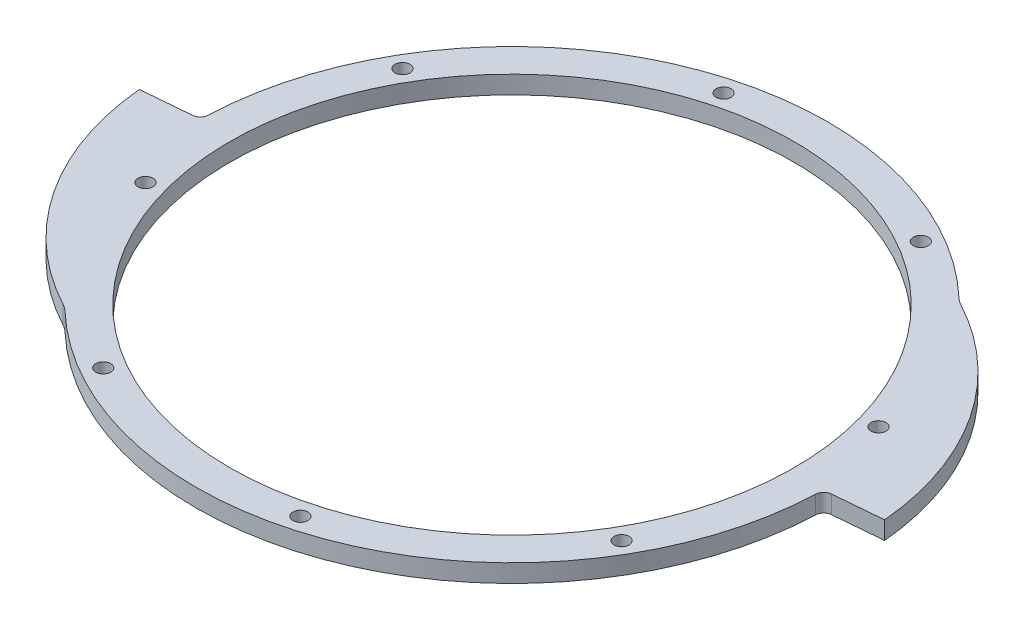
ISO-10303-21;
HEADER;
FILE_DESCRIPTION(('STEP AP214'),'2;1');
FILE_NAME('part.step','',(''),(''),'','','');
FILE_SCHEMA(('AUTOMOTIVE_DESIGN { 1 0 10303 214 1 1 1 1 }'));
ENDSEC;
DATA;
#1=APPLICATION_CONTEXT('core data for automotive mechanical design processes');
#2=APPLICATION_PROTOCOL_DEFINITION('international standard','automotive_design',2000,#1);
#3=PRODUCT_CONTEXT('',#1,'mechanical');
#4=PRODUCT('Part','Part','',(#3));
#5=PRODUCT_RELATED_PRODUCT_CATEGORY('part','',(#4));
#6=PRODUCT_DEFINITION_FORMATION('','',#4);
#7=PRODUCT_DEFINITION_CONTEXT('part definition',#1,'design');
#8=PRODUCT_DEFINITION('design','',#6,#7);
#9=PRODUCT_DEFINITION_SHAPE('','',#8);
#10=(LENGTH_UNIT() NAMED_UNIT(*) SI_UNIT(.MILLI.,.METRE.));
#11=(NAMED_UNIT(*) PLANE_ANGLE_UNIT() SI_UNIT($,.RADIAN.));
#12=(NAMED_UNIT(*) SI_UNIT($,.STERADIAN.) SOLID_ANGLE_UNIT());
#13=UNCERTAINTY_MEASURE_WITH_UNIT(LENGTH_MEASURE(1.E-05),#10,'distance_accuracy_value','');
#14=(GEOMETRIC_REPRESENTATION_CONTEXT(3) GLOBAL_UNCERTAINTY_ASSIGNED_CONTEXT((#13)) GLOBAL_UNIT_ASSIGNED_CONTEXT((#10,
#11,#12)) REPRESENTATION_CONTEXT('',''));
#15=CARTESIAN_POINT('',(0.,0.,0.));
#16=DIRECTION('',(0.,0.,1.));
#17=DIRECTION('',(1.,0.,0.));
#18=AXIS2_PLACEMENT_3D('',#15,#16,#17);
#19=CARTESIAN_POINT('',(0.,3.175,0.));
#20=DIRECTION('',(0.,-1.,0.));
#21=DIRECTION('',(0.,0.,-1.));
#22=AXIS2_PLACEMENT_3D('',#19,#20,#21);
#23=CYLINDRICAL_SURFACE('',#22,112.);
#24=DIRECTION('',(0.,-1.,0.));
#25=VECTOR('',#24,1.);
#26=CARTESIAN_POINT('',(111.913972575424,3.175,4.38893408325421));
#27=LINE('',#26,#25);
#28=CARTESIAN_POINT('',(111.913972575424,-3.175,4.38893408325421));
#29=VERTEX_POINT('',#28);
#30=CARTESIAN_POINT('',(111.913972575424,3.175,4.38893408325421));
#31=VERTEX_POINT('',#30);
#32=EDGE_CURVE('E59',#29,#31,#27,.F.);
#33=ORIENTED_EDGE('',*,*,#32,.T.);
#34=CARTESIAN_POINT('',(0.,3.175,0.));
#35=DIRECTION('',(0.,1.,0.));
#36=DIRECTION('',(0.,0.,1.));
#37=AXIS2_PLACEMENT_3D('',#34,#35,#36);
#38=CIRCLE('',#37,112.);
#39=CARTESIAN_POINT('',(-77.2844594992042,3.175,81.0623976940965));
#40=VERTEX_POINT('',#39);
#41=EDGE_CURVE('E164',#40,#31,#38,.T.);
#42=ORIENTED_EDGE('',*,*,#41,.F.);
#43=DIRECTION('',(0.,-1.,0.));
#44=VECTOR('',#43,1.);
#45=CARTESIAN_POINT('',(-77.2844594992042,3.175,81.0623976940965));
#46=LINE('',#45,#44);
#47=CARTESIAN_POINT('',(-77.2844594992042,-3.175,81.0623976940965));
#48=VERTEX_POINT('',#47);
#49=EDGE_CURVE('E179',#40,#48,#46,.T.);
#50=ORIENTED_EDGE('',*,*,#49,.T.);
#51=CARTESIAN_POINT('',(0.,-3.175,0.));
#52=DIRECTION('',(0.,1.,0.));
#53=DIRECTION('',(0.,0.,1.));
#54=AXIS2_PLACEMENT_3D('',#51,#52,#53);
#55=CIRCLE('',#54,112.);
#56=EDGE_CURVE('E174',#48,#29,#55,.T.);
#57=ORIENTED_EDGE('',*,*,#56,.T.);
#58=EDGE_LOOP('',(#33,#42,#50,#57));
#59=FACE_BOUND('',#58,.T.);
#60=ADVANCED_FACE('F36',(#59),#23,.T.);
#61=CARTESIAN_POINT('',(-32.4231042819711,3.175,-8.71184952443067));
#62=DIRECTION('',(0.,1.,0.));
#63=DIRECTION('',(0.,0.,1.));
#64=AXIS2_PLACEMENT_3D('',#61,#62,#63);
#65=PLANE('',#64);
#66=CARTESIAN_POINT('',(-91.7986928011501,3.175,-53.0000000000007));
#67=DIRECTION('',(0.,1.,0.));
#68=DIRECTION('',(-0.707106781186549,0.,0.707106781186546));
#69=AXIS2_PLACEMENT_3D('',#66,#67,#68);
#70=CIRCLE('',#69,2.65);
#71=CARTESIAN_POINT('',(-93.6725257712944,3.175,-51.1261670298564));
#72=VERTEX_POINT('',#71);
#73=EDGE_CURVE('E283',#72,#72,#70,.T.);
#74=ORIENTED_EDGE('',*,*,#73,.F.);
#75=EDGE_LOOP('',(#74));
#76=FACE_BOUND('',#75,.T.);
#77=CARTESIAN_POINT('',(-27.4348187808662,3.175,-102.388137586642));
#78=DIRECTION('',(0.,1.,0.));
#79=DIRECTION('',(-1.,0.,0.));
#80=AXIS2_PLACEMENT_3D('',#77,#78,#79);
#81=CIRCLE('',#80,2.65);
#82=CARTESIAN_POINT('',(-30.0848187808662,3.175,-102.388137586642));
#83=VERTEX_POINT('',#82);
#84=EDGE_CURVE('E289',#83,#83,#81,.T.);
#85=ORIENTED_EDGE('',*,*,#84,.F.);
#86=EDGE_LOOP('',(#85));
#87=FACE_BOUND('',#86,.T.);
#88=CARTESIAN_POINT('',(53.0000000000011,3.175,-91.7986928011499));
#89=DIRECTION('',(0.,1.,0.));
#90=DIRECTION('',(-0.707106781186544,0.,-0.707106781186551));
#91=AXIS2_PLACEMENT_3D('',#88,#89,#90);
#92=CIRCLE('',#91,2.65);
#93=CARTESIAN_POINT('',(51.1261670298567,3.175,-93.6725257712942));
#94=VERTEX_POINT('',#93);
#95=EDGE_CURVE('E297',#94,#94,#92,.T.);
#96=ORIENTED_EDGE('',*,*,#95,.F.);
#97=EDGE_LOOP('',(#96));
#98=FACE_BOUND('',#97,.T.);
#99=CARTESIAN_POINT('',(102.388137586641,3.175,-27.4348187808666));
#100=DIRECTION('',(0.,1.,0.));
#101=DIRECTION('',(0.,0.,-1.));
#102=AXIS2_PLACEMENT_3D('',#99,#100,#101);
#103=CIRCLE('',#102,2.65);
#104=CARTESIAN_POINT('',(102.388137586641,3.175,-30.0848187808666));
#105=VERTEX_POINT('',#104);
#106=EDGE_CURVE('E303',#105,#105,#103,.T.);
#107=ORIENTED_EDGE('',*,*,#106,.F.);
#108=EDGE_LOOP('',(#107));
#109=FACE_BOUND('',#108,.T.);
#110=CARTESIAN_POINT('',(91.7986928011497,3.175,53.0000000000014));
#111=DIRECTION('',(0.,1.,0.));
#112=DIRECTION('',(0.707106781186554,0.,-0.707106781186541));
#113=AXIS2_PLACEMENT_3D('',#110,#111,#112);
#114=CIRCLE('',#113,2.65);
#115=CARTESIAN_POINT('',(93.6725257712941,3.175,51.126167029857));
#116=VERTEX_POINT('',#115);
#117=EDGE_CURVE('E309',#116,#116,#114,.T.);
#118=ORIENTED_EDGE('',*,*,#117,.F.);
#119=EDGE_LOOP('',(#118));
#120=FACE_BOUND('',#119,.T.);
#121=CARTESIAN_POINT('',(27.4348187808655,3.175,102.388137586642));
#122=DIRECTION('',(0.,1.,0.));
#123=DIRECTION('',(1.,0.,0.));
#124=AXIS2_PLACEMENT_3D('',#121,#122,#123);
#125=CIRCLE('',#124,2.65);
#126=CARTESIAN_POINT('',(30.0848187808655,3.175,102.388137586642));
#127=VERTEX_POINT('',#126);
#128=EDGE_CURVE('E315',#127,#127,#125,.T.);
#129=ORIENTED_EDGE('',*,*,#128,.F.);
#130=EDGE_LOOP('',(#129));
#131=FACE_BOUND('',#130,.T.);
#132=CARTESIAN_POINT('',(-53.0000000000017,3.175,91.7986928011495));
#133=DIRECTION('',(0.,1.,0.));
#134=DIRECTION('',(0.707106781186539,0.,0.707106781186556));
#135=AXIS2_PLACEMENT_3D('',#132,#133,#134);
#136=CIRCLE('',#135,2.65);
#137=CARTESIAN_POINT('',(-51.1261670298574,3.175,93.6725257712939));
#138=VERTEX_POINT('',#137);
#139=EDGE_CURVE('E321',#138,#138,#136,.T.);
#140=ORIENTED_EDGE('',*,*,#139,.F.);
#141=EDGE_LOOP('',(#140));
#142=FACE_BOUND('',#141,.T.);
#143=CARTESIAN_POINT('',(-102.388137586641,3.175,27.4348187808666));
#144=DIRECTION('',(0.,1.,0.));
#145=DIRECTION('',(0.,0.,1.));
#146=AXIS2_PLACEMENT_3D('',#143,#144,#145);
#147=CIRCLE('',#146,2.65);
#148=CARTESIAN_POINT('',(-102.388137586641,3.175,30.0848187808666));
#149=VERTEX_POINT('',#148);
#150=EDGE_CURVE('E286',#149,#149,#147,.T.);
#151=ORIENTED_EDGE('',*,*,#150,.F.);
#152=EDGE_LOOP('',(#151));
#153=FACE_BOUND('',#152,.T.);
#154=CARTESIAN_POINT('',(77.2844594992042,3.175,-81.0623976940965));
#155=VERTEX_POINT('',#154);
#156=CARTESIAN_POINT('',(-111.913972575424,3.175,-4.38893408325421));
#157=VERTEX_POINT('',#156);
#158=EDGE_CURVE('E51',#155,#157,#38,.T.);
#159=ORIENTED_EDGE('',*,*,#158,.T.);
#160=CARTESIAN_POINT('',(-114.911668269409,3.175,-4.5064948176271));
#161=DIRECTION('',(0.,1.,0.));
#162=DIRECTION('',(0.,0.,1.));
#163=AXIS2_PLACEMENT_3D('',#160,#161,#162);
#164=CIRCLE('',#163,3.);
#165=CARTESIAN_POINT('',(-114.650201041166,3.175,-1.51791072335186));
#166=VERTEX_POINT('',#165);
#167=EDGE_CURVE('E11',#157,#166,#164,.F.);
#168=ORIENTED_EDGE('',*,*,#167,.T.);
#169=DIRECTION('',(-0.996194698091746,0.,0.0871557427476584));
#170=VECTOR('',#169,1.);
#171=CARTESIAN_POINT('',(-111.98631211554,3.175,-1.75097080523636));
#172=LINE('',#171,#170);
#173=CARTESIAN_POINT('',(-132.,3.175,0.));
#174=VERTEX_POINT('',#173);
#175=EDGE_CURVE('E166',#166,#174,#172,.T.);
#176=ORIENTED_EDGE('',*,*,#175,.T.);
#177=CARTESIAN_POINT('',(-32.4231042819711,3.175,-8.71184952443067));
#178=DIRECTION('',(0.,1.,0.));
#179=DIRECTION('',(0.,0.,1.));
#180=AXIS2_PLACEMENT_3D('',#177,#178,#179);
#181=CIRCLE('',#180,99.9572632827426);
#182=CARTESIAN_POINT('',(-79.4774148094802,3.175,79.4774148094794));
#183=VERTEX_POINT('',#182);
#184=EDGE_CURVE('E158',#174,#183,#181,.T.);
#185=ORIENTED_EDGE('',*,*,#184,.T.);
#186=CARTESIAN_POINT('',(-84.184857668776,3.175,88.3001117739266));
#187=DIRECTION('',(0.,-1.,0.));
#188=DIRECTION('',(0.,0.,-1.));
#189=AXIS2_PLACEMENT_3D('',#186,#187,#188);
#190=CIRCLE('',#189,10.);
#191=EDGE_CURVE('E161',#183,#40,#190,.T.);
#192=ORIENTED_EDGE('',*,*,#191,.T.);
#193=ORIENTED_EDGE('',*,*,#41,.T.);
#194=CARTESIAN_POINT('',(114.911668269409,3.175,4.5064948176271));
#195=DIRECTION('',(0.,1.,0.));
#196=DIRECTION('',(0.,0.,-1.));
#197=AXIS2_PLACEMENT_3D('',#194,#195,#196);
#198=CIRCLE('',#197,3.);
#199=CARTESIAN_POINT('',(114.650201041166,3.175,1.51791072335186));
#200=VERTEX_POINT('',#199);
#201=EDGE_CURVE('E149',#31,#200,#198,.F.);
#202=ORIENTED_EDGE('',*,*,#201,.T.);
#203=DIRECTION('',(0.996194698091746,0.,-0.0871557427476584));
#204=VECTOR('',#203,1.);
#205=CARTESIAN_POINT('',(111.98631211554,3.175,1.75097080523636));
#206=LINE('',#205,#204);
#207=CARTESIAN_POINT('',(132.,3.175,0.));
#208=VERTEX_POINT('',#207);
#209=EDGE_CURVE('E122',#200,#208,#206,.T.);
#210=ORIENTED_EDGE('',*,*,#209,.T.);
#211=CARTESIAN_POINT('',(32.4231042819711,3.175,8.71184952443067));
#212=DIRECTION('',(0.,1.,0.));
#213=DIRECTION('',(0.,0.,-1.));
#214=AXIS2_PLACEMENT_3D('',#211,#212,#213);
#215=CIRCLE('',#214,99.9572632827426);
#216=CARTESIAN_POINT('',(79.4774148094802,3.175,-79.4774148094794));
#217=VERTEX_POINT('',#216);
#218=EDGE_CURVE('E123',#208,#217,#215,.T.);
#219=ORIENTED_EDGE('',*,*,#218,.T.);
#220=CARTESIAN_POINT('',(84.184857668776,3.175,-88.3001117739266));
#221=DIRECTION('',(0.,-1.,0.));
#222=DIRECTION('',(0.,0.,1.));
#223=AXIS2_PLACEMENT_3D('',#220,#221,#222);
#224=CIRCLE('',#223,10.);
#225=EDGE_CURVE('E113',#217,#155,#224,.T.);
#226=ORIENTED_EDGE('',*,*,#225,.T.);
#227=EDGE_LOOP('',(#159,#168,#176,#185,#192,#193,#202,#210,#219,#226));
#228=FACE_BOUND('',#227,.T.);
#229=CARTESIAN_POINT('',(0.,3.175,0.));
#230=DIRECTION('',(0.,1.,0.));
#231=DIRECTION('',(0.,0.,1.));
#232=AXIS2_PLACEMENT_3D('',#229,#230,#231);
#233=CIRCLE('',#232,100.);
#234=CARTESIAN_POINT('',(0.,3.175,100.));
#235=VERTEX_POINT('',#234);
#236=EDGE_CURVE('E152',#235,#235,#233,.T.);
#237=ORIENTED_EDGE('',*,*,#236,.F.);
#238=EDGE_LOOP('',(#237));
#239=FACE_BOUND('',#238,.T.);
#240=ADVANCED_FACE('F126',(#76,#87,#98,#109,#120,#131,#142,#153,#228,#239),#65,.T.);
#241=CARTESIAN_POINT('',(-32.4231042819711,-3.175,-8.71184952443067));
#242=DIRECTION('',(0.,1.,0.));
#243=DIRECTION('',(0.,0.,1.));
#244=AXIS2_PLACEMENT_3D('',#241,#242,#243);
#245=PLANE('',#244);
#246=CARTESIAN_POINT('',(-91.7986928011501,-3.175,-53.0000000000007));
#247=DIRECTION('',(0.,1.,0.));
#248=DIRECTION('',(-0.707106781186549,0.,0.707106781186546));
#249=AXIS2_PLACEMENT_3D('',#246,#247,#248);
#250=CIRCLE('',#249,2.65);
#251=CARTESIAN_POINT('',(-93.6725257712944,-3.175,-51.1261670298564));
#252=VERTEX_POINT('',#251);
#253=EDGE_CURVE('E281',#252,#252,#250,.T.);
#254=ORIENTED_EDGE('',*,*,#253,.T.);
#255=EDGE_LOOP('',(#254));
#256=FACE_BOUND('',#255,.T.);
#257=CARTESIAN_POINT('',(-27.4348187808662,-3.175,-102.388137586642));
#258=DIRECTION('',(0.,1.,0.));
#259=DIRECTION('',(-1.,0.,0.));
#260=AXIS2_PLACEMENT_3D('',#257,#258,#259);
#261=CIRCLE('',#260,2.65);
#262=CARTESIAN_POINT('',(-30.0848187808662,-3.175,-102.388137586642));
#263=VERTEX_POINT('',#262);
#264=EDGE_CURVE('E284',#263,#263,#261,.T.);
#265=ORIENTED_EDGE('',*,*,#264,.T.);
#266=EDGE_LOOP('',(#265));
#267=FACE_BOUND('',#266,.T.);
#268=CARTESIAN_POINT('',(53.0000000000011,-3.175,-91.7986928011499));
#269=DIRECTION('',(0.,1.,0.));
#270=DIRECTION('',(-0.707106781186544,0.,-0.707106781186551));
#271=AXIS2_PLACEMENT_3D('',#268,#269,#270);
#272=CIRCLE('',#271,2.65);
#273=CARTESIAN_POINT('',(51.1261670298567,-3.175,-93.6725257712942));
#274=VERTEX_POINT('',#273);
#275=EDGE_CURVE('E294',#274,#274,#272,.T.);
#276=ORIENTED_EDGE('',*,*,#275,.T.);
#277=EDGE_LOOP('',(#276));
#278=FACE_BOUND('',#277,.T.);
#279=CARTESIAN_POINT('',(102.388137586641,-3.175,-27.4348187808666));
#280=DIRECTION('',(0.,1.,0.));
#281=DIRECTION('',(0.,0.,-1.));
#282=AXIS2_PLACEMENT_3D('',#279,#280,#281);
#283=CIRCLE('',#282,2.65);
#284=CARTESIAN_POINT('',(102.388137586641,-3.175,-30.0848187808666));
#285=VERTEX_POINT('',#284);
#286=EDGE_CURVE('E300',#285,#285,#283,.T.);
#287=ORIENTED_EDGE('',*,*,#286,.T.);
#288=EDGE_LOOP('',(#287));
#289=FACE_BOUND('',#288,.T.);
#290=CARTESIAN_POINT('',(91.7986928011497,-3.175,53.0000000000014));
#291=DIRECTION('',(0.,1.,0.));
#292=DIRECTION('',(0.707106781186554,0.,-0.707106781186541));
#293=AXIS2_PLACEMENT_3D('',#290,#291,#292);
#294=CIRCLE('',#293,2.65);
#295=CARTESIAN_POINT('',(93.6725257712941,-3.175,51.126167029857));
#296=VERTEX_POINT('',#295);
#297=EDGE_CURVE('E306',#296,#296,#294,.T.);
#298=ORIENTED_EDGE('',*,*,#297,.T.);
#299=EDGE_LOOP('',(#298));
#300=FACE_BOUND('',#299,.T.);
#301=CARTESIAN_POINT('',(27.4348187808655,-3.175,102.388137586642));
#302=DIRECTION('',(0.,1.,0.));
#303=DIRECTION('',(1.,0.,0.));
#304=AXIS2_PLACEMENT_3D('',#301,#302,#303);
#305=CIRCLE('',#304,2.65);
#306=CARTESIAN_POINT('',(30.0848187808655,-3.175,102.388137586642));
#307=VERTEX_POINT('',#306);
#308=EDGE_CURVE('E312',#307,#307,#305,.T.);
#309=ORIENTED_EDGE('',*,*,#308,.T.);
#310=EDGE_LOOP('',(#309));
#311=FACE_BOUND('',#310,.T.);
#312=CARTESIAN_POINT('',(-53.0000000000017,-3.175,91.7986928011495));
#313=DIRECTION('',(0.,1.,0.));
#314=DIRECTION('',(0.707106781186539,0.,0.707106781186556));
#315=AXIS2_PLACEMENT_3D('',#312,#313,#314);
#316=CIRCLE('',#315,2.65);
#317=CARTESIAN_POINT('',(-51.1261670298574,-3.175,93.6725257712939));
#318=VERTEX_POINT('',#317);
#319=EDGE_CURVE('E318',#318,#318,#316,.T.);
#320=ORIENTED_EDGE('',*,*,#319,.T.);
#321=EDGE_LOOP('',(#320));
#322=FACE_BOUND('',#321,.T.);
#323=CARTESIAN_POINT('',(-102.388137586641,-3.175,27.4348187808666));
#324=DIRECTION('',(0.,1.,0.));
#325=DIRECTION('',(0.,0.,1.));
#326=AXIS2_PLACEMENT_3D('',#323,#324,#325);
#327=CIRCLE('',#326,2.65);
#328=CARTESIAN_POINT('',(-102.388137586641,-3.175,30.0848187808666));
#329=VERTEX_POINT('',#328);
#330=EDGE_CURVE('E324',#329,#329,#327,.T.);
#331=ORIENTED_EDGE('',*,*,#330,.T.);
#332=EDGE_LOOP('',(#331));
#333=FACE_BOUND('',#332,.T.);
#334=ORIENTED_EDGE('',*,*,#56,.F.);
#335=CARTESIAN_POINT('',(-84.184857668776,-3.175,88.3001117739266));
#336=DIRECTION('',(0.,-1.,0.));
#337=DIRECTION('',(0.,0.,-1.));
#338=AXIS2_PLACEMENT_3D('',#335,#336,#337);
#339=CIRCLE('',#338,10.);
#340=CARTESIAN_POINT('',(-79.4774148094802,-3.175,79.4774148094794));
#341=VERTEX_POINT('',#340);
#342=EDGE_CURVE('E171',#341,#48,#339,.T.);
#343=ORIENTED_EDGE('',*,*,#342,.F.);
#344=CARTESIAN_POINT('',(-32.4231042819711,-3.175,-8.71184952443067));
#345=DIRECTION('',(0.,1.,0.));
#346=DIRECTION('',(0.,0.,1.));
#347=AXIS2_PLACEMENT_3D('',#344,#345,#346);
#348=CIRCLE('',#347,99.9572632827426);
#349=CARTESIAN_POINT('',(-132.,-3.175,0.));
#350=VERTEX_POINT('',#349);
#351=EDGE_CURVE('E155',#350,#341,#348,.T.);
#352=ORIENTED_EDGE('',*,*,#351,.F.);
#353=DIRECTION('',(-0.996194698091746,0.,0.0871557427476584));
#354=VECTOR('',#353,1.);
#355=CARTESIAN_POINT('',(-111.98631211554,-3.175,-1.75097080523636));
#356=LINE('',#355,#354);
#357=CARTESIAN_POINT('',(-114.650201041166,-3.175,-1.51791072335186));
#358=VERTEX_POINT('',#357);
#359=EDGE_CURVE('E162',#358,#350,#356,.T.);
#360=ORIENTED_EDGE('',*,*,#359,.F.);
#361=CARTESIAN_POINT('',(-114.911668269409,-3.175,-4.5064948176271));
#362=DIRECTION('',(0.,1.,0.));
#363=DIRECTION('',(0.,0.,1.));
#364=AXIS2_PLACEMENT_3D('',#361,#362,#363);
#365=CIRCLE('',#364,3.);
#366=CARTESIAN_POINT('',(-111.913972575424,-3.175,-4.38893408325421));
#367=VERTEX_POINT('',#366);
#368=EDGE_CURVE('E44',#358,#367,#365,.T.);
#369=ORIENTED_EDGE('',*,*,#368,.T.);
#370=CARTESIAN_POINT('',(77.2844594992042,-3.175,-81.0623976940965));
#371=VERTEX_POINT('',#370);
#372=EDGE_CURVE('E173',#371,#367,#55,.T.);
#373=ORIENTED_EDGE('',*,*,#372,.F.);
#374=CARTESIAN_POINT('',(84.184857668776,-3.175,-88.3001117739266));
#375=DIRECTION('',(0.,-1.,0.));
#376=DIRECTION('',(0.,0.,1.));
#377=AXIS2_PLACEMENT_3D('',#374,#375,#376);
#378=CIRCLE('',#377,10.);
#379=CARTESIAN_POINT('',(79.4774148094802,-3.175,-79.4774148094794));
#380=VERTEX_POINT('',#379);
#381=EDGE_CURVE('E331',#380,#371,#378,.T.);
#382=ORIENTED_EDGE('',*,*,#381,.F.);
#383=CARTESIAN_POINT('',(32.4231042819711,-3.175,8.71184952443067));
#384=DIRECTION('',(0.,1.,0.));
#385=DIRECTION('',(0.,0.,-1.));
#386=AXIS2_PLACEMENT_3D('',#383,#384,#385);
#387=CIRCLE('',#386,99.9572632827426);
#388=CARTESIAN_POINT('',(132.,-3.175,0.));
#389=VERTEX_POINT('',#388);
#390=EDGE_CURVE('E136',#389,#380,#387,.T.);
#391=ORIENTED_EDGE('',*,*,#390,.F.);
#392=DIRECTION('',(0.996194698091746,0.,-0.0871557427476584));
#393=VECTOR('',#392,1.);
#394=CARTESIAN_POINT('',(111.98631211554,-3.175,1.75097080523636));
#395=LINE('',#394,#393);
#396=CARTESIAN_POINT('',(114.650201041166,-3.175,1.51791072335186));
#397=VERTEX_POINT('',#396);
#398=EDGE_CURVE('E132',#397,#389,#395,.T.);
#399=ORIENTED_EDGE('',*,*,#398,.F.);
#400=CARTESIAN_POINT('',(114.911668269409,-3.175,4.5064948176271));
#401=DIRECTION('',(0.,1.,0.));
#402=DIRECTION('',(0.,0.,-1.));
#403=AXIS2_PLACEMENT_3D('',#400,#401,#402);
#404=CIRCLE('',#403,3.);
#405=EDGE_CURVE('E146',#397,#29,#404,.T.);
#406=ORIENTED_EDGE('',*,*,#405,.T.);
#407=EDGE_LOOP('',(#334,#343,#352,#360,#369,#373,#382,#391,#399,#406));
#408=FACE_BOUND('',#407,.T.);
#409=CARTESIAN_POINT('',(0.,-3.175,0.));
#410=DIRECTION('',(0.,1.,0.));
#411=DIRECTION('',(0.,0.,1.));
#412=AXIS2_PLACEMENT_3D('',#409,#410,#411);
#413=CIRCLE('',#412,100.);
#414=CARTESIAN_POINT('',(0.,-3.175,100.));
#415=VERTEX_POINT('',#414);
#416=EDGE_CURVE('E151',#415,#415,#413,.T.);
#417=ORIENTED_EDGE('',*,*,#416,.T.);
#418=EDGE_LOOP('',(#417));
#419=FACE_BOUND('',#418,.T.);
#420=ADVANCED_FACE('F195',(#256,#267,#278,#289,#300,#311,#322,#333,#408,#419),#245,.F.);
#421=CARTESIAN_POINT('',(-32.4231042819711,3.175,-8.71184952443067));
#422=DIRECTION('',(0.,-1.,0.));
#423=DIRECTION('',(0.,0.,-1.));
#424=AXIS2_PLACEMENT_3D('',#421,#422,#423);
#425=CYLINDRICAL_SURFACE('',#424,99.9572632827426);
#426=ORIENTED_EDGE('',*,*,#351,.T.);
#427=DIRECTION('',(0.,-1.,0.));
#428=VECTOR('',#427,1.);
#429=CARTESIAN_POINT('',(-79.4774148094802,3.175,79.4774148094794));
#430=LINE('',#429,#428);
#431=EDGE_CURVE('E182',#183,#341,#430,.T.);
#432=ORIENTED_EDGE('',*,*,#431,.F.);
#433=ORIENTED_EDGE('',*,*,#184,.F.);
#434=DIRECTION('',(0.,-1.,0.));
#435=VECTOR('',#434,1.);
#436=CARTESIAN_POINT('',(-132.,3.175,0.));
#437=LINE('',#436,#435);
#438=EDGE_CURVE('E168',#174,#350,#437,.T.);
#439=ORIENTED_EDGE('',*,*,#438,.T.);
#440=EDGE_LOOP('',(#426,#432,#433,#439));
#441=FACE_BOUND('',#440,.T.);
#442=ADVANCED_FACE('F213',(#441),#425,.T.);
#443=CARTESIAN_POINT('',(-84.184857668776,3.175,88.3001117739266));
#444=DIRECTION('',(0.,-1.,0.));
#445=DIRECTION('',(0.,0.,-1.));
#446=AXIS2_PLACEMENT_3D('',#443,#444,#445);
#447=CYLINDRICAL_SURFACE('',#446,10.);
#448=ORIENTED_EDGE('',*,*,#342,.T.);
#449=ORIENTED_EDGE('',*,*,#49,.F.);
#450=ORIENTED_EDGE('',*,*,#191,.F.);
#451=ORIENTED_EDGE('',*,*,#431,.T.);
#452=EDGE_LOOP('',(#448,#449,#450,#451));
#453=FACE_BOUND('',#452,.T.);
#454=ADVANCED_FACE('F204',(#453),#447,.F.);
#455=ORIENTED_EDGE('',*,*,#158,.F.);
#456=DIRECTION('',(0.,-1.,0.));
#457=VECTOR('',#456,1.);
#458=CARTESIAN_POINT('',(77.2844594992042,3.175,-81.0623976940965));
#459=LINE('',#458,#457);
#460=EDGE_CURVE('E120',#155,#371,#459,.T.);
#461=ORIENTED_EDGE('',*,*,#460,.T.);
#462=ORIENTED_EDGE('',*,*,#372,.T.);
#463=DIRECTION('',(0.,-1.,0.));
#464=VECTOR('',#463,1.);
#465=CARTESIAN_POINT('',(-111.913972575424,3.175,-4.38893408325421));
#466=LINE('',#465,#464);
#467=EDGE_CURVE('E188',#367,#157,#466,.F.);
#468=ORIENTED_EDGE('',*,*,#467,.T.);
#469=EDGE_LOOP('',(#455,#461,#462,#468));
#470=FACE_BOUND('',#469,.T.);
#471=ADVANCED_FACE('F201',(#470),#23,.T.);
#472=CARTESIAN_POINT('',(-111.98631211554,3.175,-1.75097080523636));
#473=DIRECTION('',(0.0871557427476584,0.,0.996194698091746));
#474=DIRECTION('',(0.996194698091746,0.,-0.0871557427476584));
#475=AXIS2_PLACEMENT_3D('',#472,#473,#474);
#476=PLANE('',#475);
#477=ORIENTED_EDGE('',*,*,#175,.F.);
#478=DIRECTION('',(0.,1.,0.));
#479=VECTOR('',#478,1.);
#480=CARTESIAN_POINT('',(-114.650201041166,-3.175,-1.51791072335186));
#481=LINE('',#480,#479);
#482=EDGE_CURVE('E185',#166,#358,#481,.F.);
#483=ORIENTED_EDGE('',*,*,#482,.T.);
#484=ORIENTED_EDGE('',*,*,#359,.T.);
#485=ORIENTED_EDGE('',*,*,#438,.F.);
#486=EDGE_LOOP('',(#477,#483,#484,#485));
#487=FACE_BOUND('',#486,.T.);
#488=ADVANCED_FACE('F203',(#487),#476,.F.);
#489=CARTESIAN_POINT('',(0.,3.175,0.));
#490=DIRECTION('',(0.,-1.,0.));
#491=DIRECTION('',(0.,0.,-1.));
#492=AXIS2_PLACEMENT_3D('',#489,#490,#491);
#493=CYLINDRICAL_SURFACE('',#492,100.);
#494=ORIENTED_EDGE('',*,*,#236,.T.);
#495=EDGE_LOOP('',(#494));
#496=FACE_BOUND('',#495,.T.);
#497=ORIENTED_EDGE('',*,*,#416,.F.);
#498=EDGE_LOOP('',(#497));
#499=FACE_BOUND('',#498,.T.);
#500=ADVANCED_FACE('F210',(#496,#499),#493,.F.);
#501=CARTESIAN_POINT('',(-114.911668269409,3.175,-4.5064948176271));
#502=DIRECTION('',(0.,-1.,0.));
#503=DIRECTION('',(0.,0.,-1.));
#504=AXIS2_PLACEMENT_3D('',#501,#502,#503);
#505=CYLINDRICAL_SURFACE('',#504,3.);
#506=ORIENTED_EDGE('',*,*,#167,.F.);
#507=ORIENTED_EDGE('',*,*,#467,.F.);
#508=ORIENTED_EDGE('',*,*,#368,.F.);
#509=ORIENTED_EDGE('',*,*,#482,.F.);
#510=EDGE_LOOP('',(#506,#507,#508,#509));
#511=FACE_BOUND('',#510,.T.);
#512=ADVANCED_FACE('F38',(#511),#505,.F.);
#513=CARTESIAN_POINT('',(32.4231042819711,3.175,8.71184952443067));
#514=DIRECTION('',(0.,-1.,0.));
#515=DIRECTION('',(0.,0.,1.));
#516=AXIS2_PLACEMENT_3D('',#513,#514,#515);
#517=CYLINDRICAL_SURFACE('',#516,99.9572632827426);
#518=ORIENTED_EDGE('',*,*,#390,.T.);
#519=DIRECTION('',(0.,-1.,0.));
#520=VECTOR('',#519,1.);
#521=CARTESIAN_POINT('',(79.4774148094802,3.175,-79.4774148094794));
#522=LINE('',#521,#520);
#523=EDGE_CURVE('E118',#217,#380,#522,.T.);
#524=ORIENTED_EDGE('',*,*,#523,.F.);
#525=ORIENTED_EDGE('',*,*,#218,.F.);
#526=DIRECTION('',(0.,-1.,0.));
#527=VECTOR('',#526,1.);
#528=CARTESIAN_POINT('',(132.,3.175,0.));
#529=LINE('',#528,#527);
#530=EDGE_CURVE('E141',#208,#389,#529,.T.);
#531=ORIENTED_EDGE('',*,*,#530,.T.);
#532=EDGE_LOOP('',(#518,#524,#525,#531));
#533=FACE_BOUND('',#532,.T.);
#534=ADVANCED_FACE('F134',(#533),#517,.T.);
#535=CARTESIAN_POINT('',(84.184857668776,3.175,-88.3001117739266));
#536=DIRECTION('',(0.,-1.,0.));
#537=DIRECTION('',(0.,0.,1.));
#538=AXIS2_PLACEMENT_3D('',#535,#536,#537);
#539=CYLINDRICAL_SURFACE('',#538,10.);
#540=ORIENTED_EDGE('',*,*,#381,.T.);
#541=ORIENTED_EDGE('',*,*,#460,.F.);
#542=ORIENTED_EDGE('',*,*,#225,.F.);
#543=ORIENTED_EDGE('',*,*,#523,.T.);
#544=EDGE_LOOP('',(#540,#541,#542,#543));
#545=FACE_BOUND('',#544,.T.);
#546=ADVANCED_FACE('F116',(#545),#539,.F.);
#547=CARTESIAN_POINT('',(111.98631211554,3.175,1.75097080523636));
#548=DIRECTION('',(-0.0871557427476584,0.,-0.996194698091746));
#549=DIRECTION('',(-0.996194698091746,0.,0.0871557427476584));
#550=AXIS2_PLACEMENT_3D('',#547,#548,#549);
#551=PLANE('',#550);
#552=ORIENTED_EDGE('',*,*,#209,.F.);
#553=DIRECTION('',(0.,1.,0.));
#554=VECTOR('',#553,1.);
#555=CARTESIAN_POINT('',(114.650201041166,-3.175,1.51791072335186));
#556=LINE('',#555,#554);
#557=EDGE_CURVE('E137',#200,#397,#556,.F.);
#558=ORIENTED_EDGE('',*,*,#557,.T.);
#559=ORIENTED_EDGE('',*,*,#398,.T.);
#560=ORIENTED_EDGE('',*,*,#530,.F.);
#561=EDGE_LOOP('',(#552,#558,#559,#560));
#562=FACE_BOUND('',#561,.T.);
#563=ADVANCED_FACE('F237',(#562),#551,.F.);
#564=CARTESIAN_POINT('',(114.911668269409,3.175,4.5064948176271));
#565=DIRECTION('',(0.,-1.,0.));
#566=DIRECTION('',(0.,0.,1.));
#567=AXIS2_PLACEMENT_3D('',#564,#565,#566);
#568=CYLINDRICAL_SURFACE('',#567,3.);
#569=ORIENTED_EDGE('',*,*,#201,.F.);
#570=ORIENTED_EDGE('',*,*,#32,.F.);
#571=ORIENTED_EDGE('',*,*,#405,.F.);
#572=ORIENTED_EDGE('',*,*,#557,.F.);
#573=EDGE_LOOP('',(#569,#570,#571,#572));
#574=FACE_BOUND('',#573,.T.);
#575=ADVANCED_FACE('F233',(#574),#568,.F.);
#576=CARTESIAN_POINT('',(-102.388137586641,-3.175,27.4348187808666));
#577=DIRECTION('',(0.,1.,0.));
#578=DIRECTION('',(0.,0.,1.));
#579=AXIS2_PLACEMENT_3D('',#576,#577,#578);
#580=CYLINDRICAL_SURFACE('',#579,2.65);
#581=ORIENTED_EDGE('',*,*,#330,.F.);
#582=EDGE_LOOP('',(#581));
#583=FACE_BOUND('',#582,.T.);
#584=ORIENTED_EDGE('',*,*,#150,.T.);
#585=EDGE_LOOP('',(#584));
#586=FACE_BOUND('',#585,.T.);
#587=ADVANCED_FACE('F236',(#583,#586),#580,.F.);
#588=CARTESIAN_POINT('',(-53.0000000000017,-3.175,91.7986928011495));
#589=DIRECTION('',(0.,1.,0.));
#590=DIRECTION('',(0.,0.,1.));
#591=AXIS2_PLACEMENT_3D('',#588,#589,#590);
#592=CYLINDRICAL_SURFACE('',#591,2.65);
#593=ORIENTED_EDGE('',*,*,#319,.F.);
#594=EDGE_LOOP('',(#593));
#595=FACE_BOUND('',#594,.T.);
#596=ORIENTED_EDGE('',*,*,#139,.T.);
#597=EDGE_LOOP('',(#596));
#598=FACE_BOUND('',#597,.T.);
#599=ADVANCED_FACE('F248',(#595,#598),#592,.F.);
#600=CARTESIAN_POINT('',(27.4348187808655,-3.175,102.388137586642));
#601=DIRECTION('',(0.,1.,0.));
#602=DIRECTION('',(0.,0.,1.));
#603=AXIS2_PLACEMENT_3D('',#600,#601,#602);
#604=CYLINDRICAL_SURFACE('',#603,2.65);
#605=ORIENTED_EDGE('',*,*,#308,.F.);
#606=EDGE_LOOP('',(#605));
#607=FACE_BOUND('',#606,.T.);
#608=ORIENTED_EDGE('',*,*,#128,.T.);
#609=EDGE_LOOP('',(#608));
#610=FACE_BOUND('',#609,.T.);
#611=ADVANCED_FACE('F252',(#607,#610),#604,.F.);
#612=CARTESIAN_POINT('',(91.7986928011497,-3.175,53.0000000000014));
#613=DIRECTION('',(0.,1.,0.));
#614=DIRECTION('',(0.,0.,1.));
#615=AXIS2_PLACEMENT_3D('',#612,#613,#614);
#616=CYLINDRICAL_SURFACE('',#615,2.65);
#617=ORIENTED_EDGE('',*,*,#297,.F.);
#618=EDGE_LOOP('',(#617));
#619=FACE_BOUND('',#618,.T.);
#620=ORIENTED_EDGE('',*,*,#117,.T.);
#621=EDGE_LOOP('',(#620));
#622=FACE_BOUND('',#621,.T.);
#623=ADVANCED_FACE('F256',(#619,#622),#616,.F.);
#624=CARTESIAN_POINT('',(102.388137586641,-3.175,-27.4348187808666));
#625=DIRECTION('',(0.,1.,0.));
#626=DIRECTION('',(0.,0.,1.));
#627=AXIS2_PLACEMENT_3D('',#624,#625,#626);
#628=CYLINDRICAL_SURFACE('',#627,2.65);
#629=ORIENTED_EDGE('',*,*,#286,.F.);
#630=EDGE_LOOP('',(#629));
#631=FACE_BOUND('',#630,.T.);
#632=ORIENTED_EDGE('',*,*,#106,.T.);
#633=EDGE_LOOP('',(#632));
#634=FACE_BOUND('',#633,.T.);
#635=ADVANCED_FACE('F260',(#631,#634),#628,.F.);
#636=CARTESIAN_POINT('',(53.0000000000011,-3.175,-91.7986928011499));
#637=DIRECTION('',(0.,1.,0.));
#638=DIRECTION('',(0.,0.,1.));
#639=AXIS2_PLACEMENT_3D('',#636,#637,#638);
#640=CYLINDRICAL_SURFACE('',#639,2.65);
#641=ORIENTED_EDGE('',*,*,#275,.F.);
#642=EDGE_LOOP('',(#641));
#643=FACE_BOUND('',#642,.T.);
#644=ORIENTED_EDGE('',*,*,#95,.T.);
#645=EDGE_LOOP('',(#644));
#646=FACE_BOUND('',#645,.T.);
#647=ADVANCED_FACE('F264',(#643,#646),#640,.F.);
#648=CARTESIAN_POINT('',(-27.4348187808662,-3.175,-102.388137586642));
#649=DIRECTION('',(0.,1.,0.));
#650=DIRECTION('',(0.,0.,1.));
#651=AXIS2_PLACEMENT_3D('',#648,#649,#650);
#652=CYLINDRICAL_SURFACE('',#651,2.65);
#653=ORIENTED_EDGE('',*,*,#264,.F.);
#654=EDGE_LOOP('',(#653));
#655=FACE_BOUND('',#654,.T.);
#656=ORIENTED_EDGE('',*,*,#84,.T.);
#657=EDGE_LOOP('',(#656));
#658=FACE_BOUND('',#657,.T.);
#659=ADVANCED_FACE('F268',(#655,#658),#652,.F.);
#660=CARTESIAN_POINT('',(-91.7986928011501,-3.175,-53.0000000000007));
#661=DIRECTION('',(0.,1.,0.));
#662=DIRECTION('',(0.,0.,1.));
#663=AXIS2_PLACEMENT_3D('',#660,#661,#662);
#664=CYLINDRICAL_SURFACE('',#663,2.65);
#665=ORIENTED_EDGE('',*,*,#253,.F.);
#666=EDGE_LOOP('',(#665));
#667=FACE_BOUND('',#666,.T.);
#668=ORIENTED_EDGE('',*,*,#73,.T.);
#669=EDGE_LOOP('',(#668));
#670=FACE_BOUND('',#669,.T.);
#671=ADVANCED_FACE('F272',(#667,#670),#664,.F.);
#672=CLOSED_SHELL('',(#60,#240,#420,#442,#454,#471,#488,#500,#512,#534,#546,#563,#575,#587,#599,
#611,#623,#635,#647,#659,#671));
#673=MANIFOLD_SOLID_BREP('B2',#672);
#674=ADVANCED_BREP_SHAPE_REPRESENTATION('',(#18,#673),#14);
#675=SHAPE_DEFINITION_REPRESENTATION(#9,#674);
ENDSEC;
END-ISO-10303-21;
